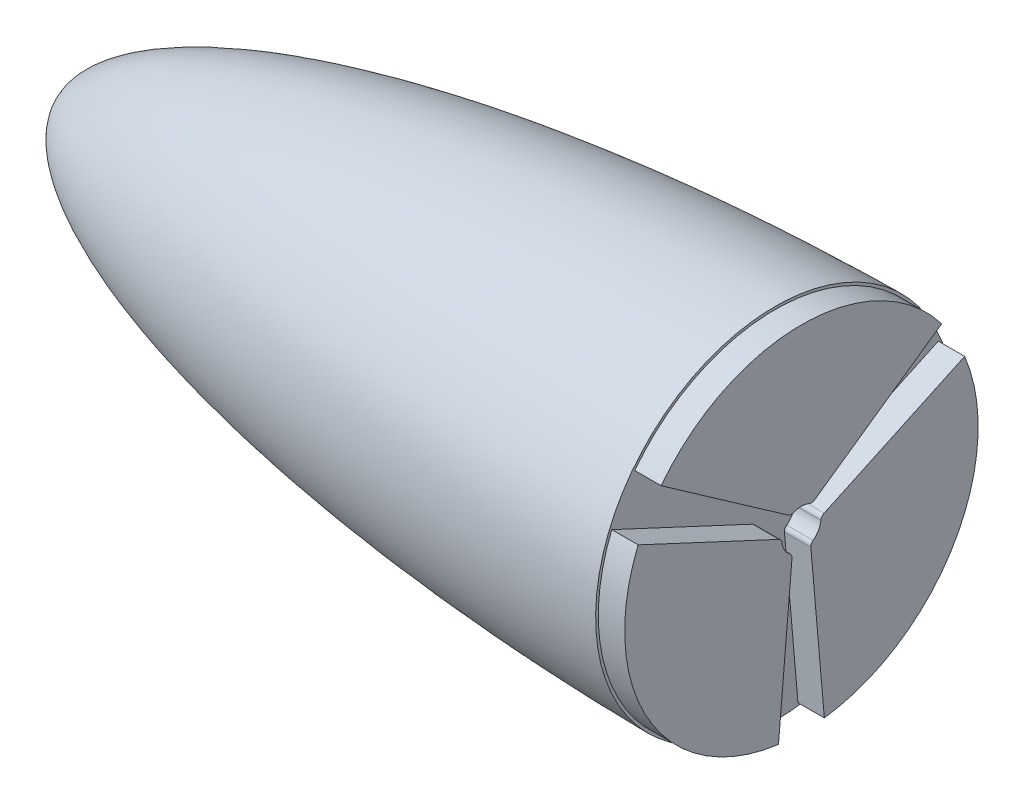
ISO-10303-21;
HEADER;
FILE_DESCRIPTION(('STEP AP214'),'2;1');
FILE_NAME('part.step','',(''),(''),'','','');
FILE_SCHEMA(('AUTOMOTIVE_DESIGN { 1 0 10303 214 1 1 1 1 }'));
ENDSEC;
DATA;
#1=APPLICATION_CONTEXT('core data for automotive mechanical design processes');
#2=APPLICATION_PROTOCOL_DEFINITION('international standard','automotive_design',2000,#1);
#3=PRODUCT_CONTEXT('',#1,'mechanical');
#4=PRODUCT('Part','Part','',(#3));
#5=PRODUCT_RELATED_PRODUCT_CATEGORY('part','',(#4));
#6=PRODUCT_DEFINITION_FORMATION('','',#4);
#7=PRODUCT_DEFINITION_CONTEXT('part definition',#1,'design');
#8=PRODUCT_DEFINITION('design','',#6,#7);
#9=PRODUCT_DEFINITION_SHAPE('','',#8);
#10=(LENGTH_UNIT() NAMED_UNIT(*) SI_UNIT(.MILLI.,.METRE.));
#11=(NAMED_UNIT(*) PLANE_ANGLE_UNIT() SI_UNIT($,.RADIAN.));
#12=(NAMED_UNIT(*) SI_UNIT($,.STERADIAN.) SOLID_ANGLE_UNIT());
#13=UNCERTAINTY_MEASURE_WITH_UNIT(LENGTH_MEASURE(1.E-05),#10,'distance_accuracy_value','');
#14=(GEOMETRIC_REPRESENTATION_CONTEXT(3) GLOBAL_UNCERTAINTY_ASSIGNED_CONTEXT((#13)) GLOBAL_UNIT_ASSIGNED_CONTEXT((#10,
#11,#12)) REPRESENTATION_CONTEXT('',''));
#15=CARTESIAN_POINT('',(0.,0.,0.));
#16=DIRECTION('',(0.,0.,1.));
#17=DIRECTION('',(1.,0.,0.));
#18=AXIS2_PLACEMENT_3D('',#15,#16,#17);
#19=CARTESIAN_POINT('',(-4.69999999999999,31.9790350616926,0.));
#20=DIRECTION('',(1.,0.,0.));
#21=DIRECTION('',(0.,1.,0.));
#22=AXIS2_PLACEMENT_3D('',#19,#20,#21);
#23=PLANE('',#22);
#24=DIRECTION('',(0.,-0.573576436351045,-0.819152044288993));
#25=VECTOR('',#24,1.);
#26=CARTESIAN_POINT('',(-4.69999999999998,19.1571618153973,25.0050625109933));
#27=LINE('',#26,#25);
#28=CARTESIAN_POINT('',(-4.69999999999998,19.1571618153973,25.0050625109933));
#29=VERTEX_POINT('',#28);
#30=CARTESIAN_POINT('',(-4.69999999999998,3.30718331001068,2.36894730161999));
#31=VERTEX_POINT('',#30);
#32=EDGE_CURVE('E623',#29,#31,#27,.T.);
#33=ORIENTED_EDGE('',*,*,#32,.F.);
#34=CARTESIAN_POINT('',(-4.69999999999998,0.,0.));
#35=DIRECTION('',(1.,0.,0.));
#36=DIRECTION('',(0.,1.,0.));
#37=AXIS2_PLACEMENT_3D('',#34,#35,#36);
#38=CIRCLE('',#37,31.5);
#39=CARTESIAN_POINT('',(-4.69999999999998,19.1571618153973,-25.0050625109933));
#40=VERTEX_POINT('',#39);
#41=EDGE_CURVE('E192',#29,#40,#38,.F.);
#42=ORIENTED_EDGE('',*,*,#41,.T.);
#43=DIRECTION('',(0.,0.573576436351044,-0.819152044288993));
#44=VECTOR('',#43,1.);
#45=CARTESIAN_POINT('',(-4.69999999999998,3.30718331001069,-2.36894730161999));
#46=LINE('',#45,#44);
#47=CARTESIAN_POINT('',(-4.69999999999998,3.30718331001068,-2.36894730161999));
#48=VERTEX_POINT('',#47);
#49=EDGE_CURVE('E171',#48,#40,#46,.T.);
#50=ORIENTED_EDGE('',*,*,#49,.F.);
#51=CARTESIAN_POINT('',(-4.69999999999998,4.12633535429968,-1.79537086526895));
#52=DIRECTION('',(1.,0.,0.));
#53=DIRECTION('',(0.,1.,0.));
#54=AXIS2_PLACEMENT_3D('',#51,#52,#53);
#55=CIRCLE('',#54,1.);
#56=CARTESIAN_POINT('',(-4.69999999999998,3.20937194223308,-1.39639956187585));
#57=VERTEX_POINT('',#56);
#58=EDGE_CURVE('E181',#57,#48,#55,.T.);
#59=ORIENTED_EDGE('',*,*,#58,.F.);
#60=CARTESIAN_POINT('',(-4.69999999999998,0.,0.));
#61=DIRECTION('',(1.,0.,0.));
#62=DIRECTION('',(0.,1.,0.));
#63=AXIS2_PLACEMENT_3D('',#60,#61,#62);
#64=CIRCLE('',#63,3.5);
#65=CARTESIAN_POINT('',(-4.69999999999998,3.20937194223308,1.39639956187585));
#66=VERTEX_POINT('',#65);
#67=EDGE_CURVE('E187',#66,#57,#64,.F.);
#68=ORIENTED_EDGE('',*,*,#67,.F.);
#69=CARTESIAN_POINT('',(-4.69999999999998,4.12633535429968,1.79537086526895));
#70=DIRECTION('',(1.,0.,0.));
#71=DIRECTION('',(0.,1.,0.));
#72=AXIS2_PLACEMENT_3D('',#69,#70,#71);
#73=CIRCLE('',#72,1.);
#74=EDGE_CURVE('E626',#31,#66,#73,.T.);
#75=ORIENTED_EDGE('',*,*,#74,.F.);
#76=EDGE_LOOP('',(#33,#42,#50,#59,#68,#75));
#77=FACE_BOUND('',#76,.T.);
#78=DIRECTION('',(0.,-0.422618261740702,0.906307787036649));
#79=VECTOR('',#78,1.);
#80=CARTESIAN_POINT('',(-4.69999999999998,12.0764384500395,-29.0931200520399));
#81=LINE('',#80,#79);
#82=CARTESIAN_POINT('',(-4.69999999999998,12.0764384500395,-29.0931200520399));
#83=VERTEX_POINT('',#82);
#84=CARTESIAN_POINT('',(-4.69999999999998,0.397976888424168,-4.04857841225115));
#85=VERTEX_POINT('',#84);
#86=EDGE_CURVE('E193',#83,#85,#81,.T.);
#87=ORIENTED_EDGE('',*,*,#86,.F.);
#88=CARTESIAN_POINT('',(-4.69999999999998,0.,0.));
#89=DIRECTION('',(1.,0.,0.));
#90=DIRECTION('',(0.,1.,0.));
#91=AXIS2_PLACEMENT_3D('',#88,#89,#90);
#92=CIRCLE('',#91,31.5);
#93=CARTESIAN_POINT('',(-4.69999999999998,-31.2336002654368,-4.08805754104661));
#94=VERTEX_POINT('',#93);
#95=EDGE_CURVE('E202',#83,#94,#92,.F.);
#96=ORIENTED_EDGE('',*,*,#95,.T.);
#97=DIRECTION('',(0.,-0.996194698091746,-0.0871557427476563));
#98=VECTOR('',#97,1.);
#99=CARTESIAN_POINT('',(-4.69999999999998,-3.70516019843484,-1.67963111063116));
#100=LINE('',#99,#98);
#101=CARTESIAN_POINT('',(-4.69999999999998,-3.70516019843485,-1.67963111063116));
#102=VERTEX_POINT('',#101);
#103=EDGE_CURVE('E589',#102,#94,#100,.T.);
#104=ORIENTED_EDGE('',*,*,#103,.F.);
#105=CARTESIAN_POINT('',(-4.69999999999998,-3.61800445568719,-2.67582580872291));
#106=DIRECTION('',(1.,0.,0.));
#107=DIRECTION('',(0.,1.,0.));
#108=AXIS2_PLACEMENT_3D('',#105,#106,#107);
#109=CIRCLE('',#108,1.);
#110=CARTESIAN_POINT('',(-4.69999999999998,-2.81400346553449,-2.08119785122893));
#111=VERTEX_POINT('',#110);
#112=EDGE_CURVE('E601',#111,#102,#109,.T.);
#113=ORIENTED_EDGE('',*,*,#112,.F.);
#114=CARTESIAN_POINT('',(-4.69999999999998,0.,0.));
#115=DIRECTION('',(1.,0.,0.));
#116=DIRECTION('',(0.,1.,0.));
#117=AXIS2_PLACEMENT_3D('',#114,#115,#116);
#118=CIRCLE('',#117,3.5);
#119=CARTESIAN_POINT('',(-4.69999999999998,-0.395368476698597,-3.47759741310478));
#120=VERTEX_POINT('',#119);
#121=EDGE_CURVE('E604',#120,#111,#118,.F.);
#122=ORIENTED_EDGE('',*,*,#121,.F.);
#123=CARTESIAN_POINT('',(-4.69999999999998,-0.508330898612481,-4.47119667399186));
#124=DIRECTION('',(1.,0.,0.));
#125=DIRECTION('',(0.,1.,0.));
#126=AXIS2_PLACEMENT_3D('',#123,#124,#125);
#127=CIRCLE('',#126,1.);
#128=EDGE_CURVE('E198',#85,#120,#127,.T.);
#129=ORIENTED_EDGE('',*,*,#128,.F.);
#130=EDGE_LOOP('',(#87,#96,#104,#113,#122,#129));
#131=FACE_BOUND('',#130,.T.);
#132=DIRECTION('',(0.,0.996194698091746,-0.0871557427476555));
#133=VECTOR('',#132,1.);
#134=CARTESIAN_POINT('',(-4.69999999999997,-31.2336002654368,4.08805754104658));
#135=LINE('',#134,#133);
#136=CARTESIAN_POINT('',(-4.69999999999997,-31.2336002654368,4.08805754104658));
#137=VERTEX_POINT('',#136);
#138=CARTESIAN_POINT('',(-4.69999999999998,-3.70516019843485,1.67963111063116));
#139=VERTEX_POINT('',#138);
#140=EDGE_CURVE('E585',#137,#139,#135,.T.);
#141=ORIENTED_EDGE('',*,*,#140,.F.);
#142=CARTESIAN_POINT('',(-4.69999999999998,0.,0.));
#143=DIRECTION('',(1.,0.,0.));
#144=DIRECTION('',(0.,1.,0.));
#145=AXIS2_PLACEMENT_3D('',#142,#143,#144);
#146=CIRCLE('',#145,31.5);
#147=CARTESIAN_POINT('',(-4.69999999999998,12.0764384500395,29.0931200520399));
#148=VERTEX_POINT('',#147);
#149=EDGE_CURVE('E210',#137,#148,#146,.F.);
#150=ORIENTED_EDGE('',*,*,#149,.T.);
#151=DIRECTION('',(0.,0.422618261740701,0.906307787036649));
#152=VECTOR('',#151,1.);
#153=CARTESIAN_POINT('',(-4.69999999999998,0.397976888424167,4.04857841225116));
#154=LINE('',#153,#152);
#155=CARTESIAN_POINT('',(-4.69999999999998,0.397976888424166,4.04857841225115));
#156=VERTEX_POINT('',#155);
#157=EDGE_CURVE('E621',#156,#148,#154,.T.);
#158=ORIENTED_EDGE('',*,*,#157,.F.);
#159=CARTESIAN_POINT('',(-4.69999999999998,-0.508330898612485,4.47119667399186));
#160=DIRECTION('',(1.,0.,0.));
#161=DIRECTION('',(0.,1.,0.));
#162=AXIS2_PLACEMENT_3D('',#159,#160,#161);
#163=CIRCLE('',#162,1.);
#164=CARTESIAN_POINT('',(-4.69999999999998,-0.395368476698599,3.47759741310478));
#165=VERTEX_POINT('',#164);
#166=EDGE_CURVE('E575',#165,#156,#163,.T.);
#167=ORIENTED_EDGE('',*,*,#166,.F.);
#168=CARTESIAN_POINT('',(-4.69999999999998,0.,0.));
#169=DIRECTION('',(1.,0.,0.));
#170=DIRECTION('',(0.,1.,0.));
#171=AXIS2_PLACEMENT_3D('',#168,#169,#170);
#172=CIRCLE('',#171,3.5);
#173=CARTESIAN_POINT('',(-4.69999999999998,-2.81400346553449,2.08119785122893));
#174=VERTEX_POINT('',#173);
#175=EDGE_CURVE('E594',#174,#165,#172,.F.);
#176=ORIENTED_EDGE('',*,*,#175,.F.);
#177=CARTESIAN_POINT('',(-4.69999999999998,-3.6180044556872,2.67582580872291));
#178=DIRECTION('',(1.,0.,0.));
#179=DIRECTION('',(0.,1.,0.));
#180=AXIS2_PLACEMENT_3D('',#177,#178,#179);
#181=CIRCLE('',#180,1.);
#182=EDGE_CURVE('E590',#139,#174,#181,.T.);
#183=ORIENTED_EDGE('',*,*,#182,.F.);
#184=EDGE_LOOP('',(#141,#150,#158,#167,#176,#183));
#185=FACE_BOUND('',#184,.T.);
#186=CARTESIAN_POINT('',(-4.69999999999997,0.,0.));
#187=DIRECTION('',(-1.,0.,0.));
#188=DIRECTION('',(0.,-1.,0.));
#189=AXIS2_PLACEMENT_3D('',#186,#187,#188);
#190=CIRCLE('',#189,31.9790350616926);
#191=CARTESIAN_POINT('',(-4.69999999999996,-31.9790350616926,0.));
#192=VERTEX_POINT('',#191);
#193=EDGE_CURVE('E237',#192,#192,#190,.T.);
#194=ORIENTED_EDGE('',*,*,#193,.F.);
#195=EDGE_LOOP('',(#194));
#196=FACE_BOUND('',#195,.T.);
#197=ADVANCED_FACE('F38',(#77,#131,#185,#196),#23,.T.);
#198=CARTESIAN_POINT('',(-131.041604602779,0.,0.));
#199=DIRECTION('',(1.,0.,0.));
#200=DIRECTION('',(0.,1.,0.));
#201=AXIS2_PLACEMENT_3D('',#198,#199,#200);
#202=CONICAL_SURFACE('',#201,0.,1.46069474876137);
#203=CARTESIAN_POINT('',(-130.931055959932,0.,0.));
#204=DIRECTION('',(-1.,0.,0.));
#205=DIRECTION('',(0.,-1.,0.));
#206=AXIS2_PLACEMENT_3D('',#203,#204,#205);
#207=CIRCLE('',#206,1.00000000000001);
#208=CARTESIAN_POINT('',(-130.931055959932,-1.00000000000002,0.));
#209=VERTEX_POINT('',#208);
#210=EDGE_CURVE('E563',#209,#209,#207,.T.);
#211=ORIENTED_EDGE('',*,*,#210,.T.);
#212=EDGE_LOOP('',(#211));
#213=FACE_BOUND('',#212,.T.);
#214=CARTESIAN_POINT('',(-131.041604602779,0.,0.));
#215=VERTEX_POINT('',#214);
#216=VERTEX_LOOP('',#215);
#217=FACE_BOUND('',#216,.T.);
#218=ADVANCED_FACE('F264',(#213,#217),#202,.T.);
#219=CARTESIAN_POINT('',(-130.931055959932,1.00000000000001,0.));
#220=CARTESIAN_POINT('',(-130.865742506372,1.47381555135,0.));
#221=CARTESIAN_POINT('',(-130.651172956967,2.38881913210286,0.));
#222=CARTESIAN_POINT('',(-129.84731326767,4.28583718277814,0.));
#223=CARTESIAN_POINT('',(-128.119817366122,6.69901842769236,0.));
#224=CARTESIAN_POINT('',(-124.84839957675,9.62348496806843,0.));
#225=CARTESIAN_POINT('',(-120.403954252426,12.4998788464775,0.));
#226=CARTESIAN_POINT('',(-114.83293554596,15.2811529394665,0.));
#227=CARTESIAN_POINT('',(-105.980733044591,18.8122966931907,0.));
#228=CARTESIAN_POINT('',(-92.4063202601802,22.8163482242186,0.));
#229=CARTESIAN_POINT('',(-72.7180652242926,26.767950382988,0.));
#230=CARTESIAN_POINT('',(-50.363967687195,29.7157861327046,0.));
#231=CARTESIAN_POINT('',(-30.1948269393781,31.2434611253041,0.));
#232=CARTESIAN_POINT('',(-13.5883296727057,31.874860447828,0.));
#233=CARTESIAN_POINT('',(-5.18845195188157,31.991136157211,0.));
#234=CARTESIAN_POINT('',(-1.00000008461594,31.9990851485101,0.));
#235=B_SPLINE_CURVE_WITH_KNOTS('',3,(#219,#220,#221,#222,#223,#224,#225,#226,#227,#228,#229,
#230,#231,#232,#233,#234),.UNSPECIFIED.,.F.,.F.,(4,1,1,1,1,1,1,1,1,1,1,1,1,4),
(-1.56320612069865,-1.51543242519789,-1.46765872969714,-1.37211133869563,-1.27656394769413,
-1.18101655669262,-1.08546916569112,-0.98992177468961,-0.798826992686597,-0.607732210683585,
-0.416637428680573,-0.22554264667756,-0.129995255676054,-0.0344478646745481),.UNSPECIFIED.);
#236=CARTESIAN_POINT('',(-92.0000000000302,0.,0.));
#237=DIRECTION('',(-1.,0.,0.));
#238=AXIS1_PLACEMENT('',#236,#237);
#239=SURFACE_OF_REVOLUTION('',#235,#238);
#240=ORIENTED_EDGE('',*,*,#193,.T.);
#241=EDGE_LOOP('',(#240));
#242=FACE_BOUND('',#241,.T.);
#243=ORIENTED_EDGE('',*,*,#210,.F.);
#244=EDGE_LOOP('',(#243));
#245=FACE_BOUND('',#244,.T.);
#246=ADVANCED_FACE('F259',(#242,#245),#239,.F.);
#247=CARTESIAN_POINT('',(-62.28165003066,0.,0.));
#248=DIRECTION('',(1.,0.,0.));
#249=DIRECTION('',(0.,1.,0.));
#250=AXIS2_PLACEMENT_3D('',#247,#248,#249);
#251=CYLINDRICAL_SURFACE('',#250,3.5);
#252=CARTESIAN_POINT('',(0.,0.,0.));
#253=DIRECTION('',(-1.,0.,0.));
#254=DIRECTION('',(0.,1.,0.));
#255=AXIS2_PLACEMENT_3D('',#252,#253,#254);
#256=CIRCLE('',#255,3.5);
#257=CARTESIAN_POINT('',(0.,3.20937194223308,1.39639956187585));
#258=VERTEX_POINT('',#257);
#259=CARTESIAN_POINT('',(0.,3.20937194223308,-1.39639956187585));
#260=VERTEX_POINT('',#259);
#261=EDGE_CURVE('E61',#258,#260,#256,.T.);
#262=ORIENTED_EDGE('',*,*,#261,.F.);
#263=DIRECTION('',(1.,0.,0.));
#264=VECTOR('',#263,1.);
#265=CARTESIAN_POINT('',(-62.28165003066,3.20937194223307,1.39639956187585));
#266=LINE('',#265,#264);
#267=EDGE_CURVE('E177',#66,#258,#266,.T.);
#268=ORIENTED_EDGE('',*,*,#267,.F.);
#269=ORIENTED_EDGE('',*,*,#67,.T.);
#270=DIRECTION('',(1.,0.,0.));
#271=VECTOR('',#270,1.);
#272=CARTESIAN_POINT('',(-62.28165003066,3.20937194223308,-1.39639956187585));
#273=LINE('',#272,#271);
#274=EDGE_CURVE('E183',#260,#57,#273,.F.);
#275=ORIENTED_EDGE('',*,*,#274,.F.);
#276=EDGE_LOOP('',(#262,#268,#269,#275));
#277=FACE_BOUND('',#276,.T.);
#278=ADVANCED_FACE('F263',(#277),#251,.F.);
#279=CARTESIAN_POINT('',(-62.28165003066,2.95820931443388,1.87056078543216));
#280=DIRECTION('',(0.,-0.819152044288993,0.573576436351044));
#281=DIRECTION('',(0.,-0.573576436351044,-0.819152044288993));
#282=AXIS2_PLACEMENT_3D('',#279,#280,#281);
#283=PLANE('',#282);
#284=DIRECTION('',(0.,-0.573576436351044,-0.819152044288993));
#285=VECTOR('',#284,1.);
#286=CARTESIAN_POINT('',(0.,2.95820931443389,1.87056078543216));
#287=LINE('',#286,#285);
#288=CARTESIAN_POINT('',(0.,19.1571618153973,25.0050625109933));
#289=VERTEX_POINT('',#288);
#290=CARTESIAN_POINT('',(0.,3.30718331001068,2.36894730161999));
#291=VERTEX_POINT('',#290);
#292=EDGE_CURVE('E244',#289,#291,#287,.T.);
#293=ORIENTED_EDGE('',*,*,#292,.F.);
#294=DIRECTION('',(1.,0.,0.));
#295=VECTOR('',#294,1.);
#296=CARTESIAN_POINT('',(-62.28165003066,19.1571618153973,25.0050625109933));
#297=LINE('',#296,#295);
#298=EDGE_CURVE('E238',#29,#289,#297,.T.);
#299=ORIENTED_EDGE('',*,*,#298,.F.);
#300=ORIENTED_EDGE('',*,*,#32,.T.);
#301=DIRECTION('',(-1.,0.,0.));
#302=VECTOR('',#301,1.);
#303=CARTESIAN_POINT('',(-3.7,3.30718331001068,2.36894730161999));
#304=LINE('',#303,#302);
#305=EDGE_CURVE('E547',#291,#31,#304,.T.);
#306=ORIENTED_EDGE('',*,*,#305,.F.);
#307=EDGE_LOOP('',(#293,#299,#300,#306));
#308=FACE_BOUND('',#307,.T.);
#309=ADVANCED_FACE('F316',(#308),#283,.T.);
#310=CARTESIAN_POINT('',(-62.28165003066,0.,0.));
#311=DIRECTION('',(1.,0.,0.));
#312=DIRECTION('',(0.,1.,0.));
#313=AXIS2_PLACEMENT_3D('',#310,#311,#312);
#314=CYLINDRICAL_SURFACE('',#313,31.5);
#315=ORIENTED_EDGE('',*,*,#41,.F.);
#316=ORIENTED_EDGE('',*,*,#298,.T.);
#317=CARTESIAN_POINT('',(0.,0.,0.));
#318=DIRECTION('',(1.,0.,0.));
#319=DIRECTION('',(0.,1.,0.));
#320=AXIS2_PLACEMENT_3D('',#317,#318,#319);
#321=CIRCLE('',#320,31.5);
#322=CARTESIAN_POINT('',(0.,19.1571618153973,-25.0050625109933));
#323=VERTEX_POINT('',#322);
#324=EDGE_CURVE('E241',#323,#289,#321,.T.);
#325=ORIENTED_EDGE('',*,*,#324,.F.);
#326=DIRECTION('',(1.,0.,0.));
#327=VECTOR('',#326,1.);
#328=CARTESIAN_POINT('',(-62.28165003066,19.1571618153973,-25.0050625109933));
#329=LINE('',#328,#327);
#330=EDGE_CURVE('E247',#40,#323,#329,.T.);
#331=ORIENTED_EDGE('',*,*,#330,.F.);
#332=EDGE_LOOP('',(#315,#316,#325,#331));
#333=FACE_BOUND('',#332,.T.);
#334=ADVANCED_FACE('F322',(#333),#314,.T.);
#335=CARTESIAN_POINT('',(-62.28165003066,2.95820931443388,-1.87056078543216));
#336=DIRECTION('',(0.,-0.819152044288993,-0.573576436351044));
#337=DIRECTION('',(0.,0.573576436351044,-0.819152044288993));
#338=AXIS2_PLACEMENT_3D('',#335,#336,#337);
#339=PLANE('',#338);
#340=DIRECTION('',(-1.,0.,0.));
#341=VECTOR('',#340,1.);
#342=CARTESIAN_POINT('',(0.,3.30718331001068,-2.36894730161999));
#343=LINE('',#342,#341);
#344=CARTESIAN_POINT('',(0.,3.30718331001068,-2.36894730161999));
#345=VERTEX_POINT('',#344);
#346=EDGE_CURVE('E167',#48,#345,#343,.F.);
#347=ORIENTED_EDGE('',*,*,#346,.F.);
#348=ORIENTED_EDGE('',*,*,#49,.T.);
#349=ORIENTED_EDGE('',*,*,#330,.T.);
#350=DIRECTION('',(0.,0.573576436351044,-0.819152044288993));
#351=VECTOR('',#350,1.);
#352=CARTESIAN_POINT('',(0.,2.95820931443389,-1.87056078543216));
#353=LINE('',#352,#351);
#354=EDGE_CURVE('E174',#345,#323,#353,.T.);
#355=ORIENTED_EDGE('',*,*,#354,.F.);
#356=EDGE_LOOP('',(#347,#348,#349,#355));
#357=FACE_BOUND('',#356,.T.);
#358=ADVANCED_FACE('F169',(#357),#339,.T.);
#359=CARTESIAN_POINT('',(-62.28165003066,0.,0.));
#360=DIRECTION('',(1.,0.,0.));
#361=DIRECTION('',(0.,1.,0.));
#362=AXIS2_PLACEMENT_3D('',#359,#360,#361);
#363=CYLINDRICAL_SURFACE('',#362,3.5);
#364=DIRECTION('',(1.,0.,0.));
#365=VECTOR('',#364,1.);
#366=CARTESIAN_POINT('',(-62.28165003066,-0.395368476698604,-3.47759741310478));
#367=LINE('',#366,#365);
#368=CARTESIAN_POINT('',(0.,-0.395368476698597,-3.47759741310478));
#369=VERTEX_POINT('',#368);
#370=EDGE_CURVE('E552',#120,#369,#367,.T.);
#371=ORIENTED_EDGE('',*,*,#370,.F.);
#372=ORIENTED_EDGE('',*,*,#121,.T.);
#373=DIRECTION('',(1.,0.,0.));
#374=VECTOR('',#373,1.);
#375=CARTESIAN_POINT('',(-62.28165003066,-2.81400346553449,-2.08119785122893));
#376=LINE('',#375,#374);
#377=CARTESIAN_POINT('',(0.,-2.81400346553448,-2.08119785122893));
#378=VERTEX_POINT('',#377);
#379=EDGE_CURVE('E554',#378,#111,#376,.F.);
#380=ORIENTED_EDGE('',*,*,#379,.F.);
#381=CARTESIAN_POINT('',(0.,0.,0.));
#382=DIRECTION('',(-1.,0.,0.));
#383=DIRECTION('',(0.,1.,0.));
#384=AXIS2_PLACEMENT_3D('',#381,#382,#383);
#385=CIRCLE('',#384,3.5);
#386=EDGE_CURVE('E206',#369,#378,#385,.T.);
#387=ORIENTED_EDGE('',*,*,#386,.F.);
#388=EDGE_LOOP('',(#371,#372,#380,#387));
#389=FACE_BOUND('',#388,.T.);
#390=ADVANCED_FACE('F337',(#389),#363,.F.);
#391=CARTESIAN_POINT('',(-62.28165003066,0.140848502290271,-3.49716480872758));
#392=DIRECTION('',(0.,0.906307787036649,0.422618261740702));
#393=DIRECTION('',(0.,-0.422618261740702,0.906307787036649));
#394=AXIS2_PLACEMENT_3D('',#391,#392,#393);
#395=PLANE('',#394);
#396=DIRECTION('',(0.,-0.422618261740702,0.906307787036649));
#397=VECTOR('',#396,1.);
#398=CARTESIAN_POINT('',(0.,0.140848502290279,-3.49716480872758));
#399=LINE('',#398,#397);
#400=CARTESIAN_POINT('',(0.,12.0764384500395,-29.0931200520399));
#401=VERTEX_POINT('',#400);
#402=CARTESIAN_POINT('',(0.,0.397976888424169,-4.04857841225115));
#403=VERTEX_POINT('',#402);
#404=EDGE_CURVE('E216',#401,#403,#399,.T.);
#405=ORIENTED_EDGE('',*,*,#404,.F.);
#406=DIRECTION('',(1.,0.,0.));
#407=VECTOR('',#406,1.);
#408=CARTESIAN_POINT('',(-62.28165003066,12.0764384500395,-29.0931200520399));
#409=LINE('',#408,#407);
#410=EDGE_CURVE('E205',#83,#401,#409,.T.);
#411=ORIENTED_EDGE('',*,*,#410,.F.);
#412=ORIENTED_EDGE('',*,*,#86,.T.);
#413=DIRECTION('',(-1.,0.,0.));
#414=VECTOR('',#413,1.);
#415=CARTESIAN_POINT('',(-3.7,0.397976888424168,-4.04857841225115));
#416=LINE('',#415,#414);
#417=EDGE_CURVE('E178',#403,#85,#416,.T.);
#418=ORIENTED_EDGE('',*,*,#417,.F.);
#419=EDGE_LOOP('',(#405,#411,#412,#418));
#420=FACE_BOUND('',#419,.T.);
#421=ADVANCED_FACE('F344',(#420),#395,.T.);
#422=CARTESIAN_POINT('',(-62.28165003066,0.,0.));
#423=DIRECTION('',(1.,0.,0.));
#424=DIRECTION('',(0.,1.,0.));
#425=AXIS2_PLACEMENT_3D('',#422,#423,#424);
#426=CYLINDRICAL_SURFACE('',#425,31.5);
#427=ORIENTED_EDGE('',*,*,#95,.F.);
#428=ORIENTED_EDGE('',*,*,#410,.T.);
#429=CARTESIAN_POINT('',(0.,0.,0.));
#430=DIRECTION('',(1.,0.,0.));
#431=DIRECTION('',(0.,1.,0.));
#432=AXIS2_PLACEMENT_3D('',#429,#430,#431);
#433=CIRCLE('',#432,31.5);
#434=CARTESIAN_POINT('',(0.,-31.2336002654368,-4.08805754104661));
#435=VERTEX_POINT('',#434);
#436=EDGE_CURVE('E213',#435,#401,#433,.T.);
#437=ORIENTED_EDGE('',*,*,#436,.F.);
#438=DIRECTION('',(1.,0.,0.));
#439=VECTOR('',#438,1.);
#440=CARTESIAN_POINT('',(-62.2816500306599,-31.2336002654368,-4.08805754104661));
#441=LINE('',#440,#439);
#442=EDGE_CURVE('E219',#94,#435,#441,.T.);
#443=ORIENTED_EDGE('',*,*,#442,.F.);
#444=EDGE_LOOP('',(#427,#428,#437,#443));
#445=FACE_BOUND('',#444,.T.);
#446=ADVANCED_FACE('F352',(#445),#426,.T.);
#447=CARTESIAN_POINT('',(-62.28165003066,-3.09905781672418,-1.62660402329542));
#448=DIRECTION('',(0.,-0.0871557427476564,0.996194698091746));
#449=DIRECTION('',(0.,-0.996194698091746,-0.0871557427476564));
#450=AXIS2_PLACEMENT_3D('',#447,#448,#449);
#451=PLANE('',#450);
#452=DIRECTION('',(-1.,0.,0.));
#453=VECTOR('',#452,1.);
#454=CARTESIAN_POINT('',(0.,-3.70516019843485,-1.67963111063116));
#455=LINE('',#454,#453);
#456=CARTESIAN_POINT('',(0.,-3.70516019843485,-1.67963111063116));
#457=VERTEX_POINT('',#456);
#458=EDGE_CURVE('E544',#102,#457,#455,.F.);
#459=ORIENTED_EDGE('',*,*,#458,.F.);
#460=ORIENTED_EDGE('',*,*,#103,.T.);
#461=ORIENTED_EDGE('',*,*,#442,.T.);
#462=DIRECTION('',(0.,-0.996194698091746,-0.0871557427476564));
#463=VECTOR('',#462,1.);
#464=CARTESIAN_POINT('',(0.,-3.09905781672417,-1.62660402329542));
#465=LINE('',#464,#463);
#466=EDGE_CURVE('E209',#457,#435,#465,.T.);
#467=ORIENTED_EDGE('',*,*,#466,.F.);
#468=EDGE_LOOP('',(#459,#460,#461,#467));
#469=FACE_BOUND('',#468,.T.);
#470=ADVANCED_FACE('F360',(#469),#451,.T.);
#471=CARTESIAN_POINT('',(-62.28165003066,0.,0.));
#472=DIRECTION('',(1.,0.,0.));
#473=DIRECTION('',(0.,1.,0.));
#474=AXIS2_PLACEMENT_3D('',#471,#472,#473);
#475=CYLINDRICAL_SURFACE('',#474,3.5);
#476=CARTESIAN_POINT('',(0.,0.,0.));
#477=DIRECTION('',(-1.,0.,0.));
#478=DIRECTION('',(0.,1.,0.));
#479=AXIS2_PLACEMENT_3D('',#476,#477,#478);
#480=CIRCLE('',#479,3.5);
#481=CARTESIAN_POINT('',(0.,-2.81400346553448,2.08119785122893));
#482=VERTEX_POINT('',#481);
#483=CARTESIAN_POINT('',(0.,-0.395368476698599,3.47759741310478));
#484=VERTEX_POINT('',#483);
#485=EDGE_CURVE('E53',#482,#484,#480,.T.);
#486=ORIENTED_EDGE('',*,*,#485,.F.);
#487=DIRECTION('',(1.,0.,0.));
#488=VECTOR('',#487,1.);
#489=CARTESIAN_POINT('',(-62.28165003066,-2.81400346553449,2.08119785122893));
#490=LINE('',#489,#488);
#491=EDGE_CURVE('E560',#174,#482,#490,.T.);
#492=ORIENTED_EDGE('',*,*,#491,.F.);
#493=ORIENTED_EDGE('',*,*,#175,.T.);
#494=DIRECTION('',(1.,0.,0.));
#495=VECTOR('',#494,1.);
#496=CARTESIAN_POINT('',(-62.28165003066,-0.395368476698607,3.47759741310478));
#497=LINE('',#496,#495);
#498=EDGE_CURVE('E558',#484,#165,#497,.F.);
#499=ORIENTED_EDGE('',*,*,#498,.F.);
#500=EDGE_LOOP('',(#486,#492,#493,#499));
#501=FACE_BOUND('',#500,.T.);
#502=ADVANCED_FACE('F368',(#501),#475,.F.);
#503=CARTESIAN_POINT('',(-62.28165003066,-3.09905781672418,1.62660402329542));
#504=DIRECTION('',(0.,-0.0871557427476557,-0.996194698091746));
#505=DIRECTION('',(0.,0.996194698091746,-0.0871557427476557));
#506=AXIS2_PLACEMENT_3D('',#503,#504,#505);
#507=PLANE('',#506);
#508=DIRECTION('',(0.,0.996194698091746,-0.0871557427476556));
#509=VECTOR('',#508,1.);
#510=CARTESIAN_POINT('',(0.,-3.09905781672417,1.62660402329542));
#511=LINE('',#510,#509);
#512=CARTESIAN_POINT('',(0.,-31.2336002654368,4.08805754104658));
#513=VERTEX_POINT('',#512);
#514=CARTESIAN_POINT('',(0.,-3.70516019843485,1.67963111063116));
#515=VERTEX_POINT('',#514);
#516=EDGE_CURVE('E230',#513,#515,#511,.T.);
#517=ORIENTED_EDGE('',*,*,#516,.F.);
#518=DIRECTION('',(1.,0.,0.));
#519=VECTOR('',#518,1.);
#520=CARTESIAN_POINT('',(-62.2816500306599,-31.2336002654368,4.08805754104658));
#521=LINE('',#520,#519);
#522=EDGE_CURVE('E223',#137,#513,#521,.T.);
#523=ORIENTED_EDGE('',*,*,#522,.F.);
#524=ORIENTED_EDGE('',*,*,#140,.T.);
#525=DIRECTION('',(-1.,0.,0.));
#526=VECTOR('',#525,1.);
#527=CARTESIAN_POINT('',(-3.7,-3.70516019843485,1.67963111063116));
#528=LINE('',#527,#526);
#529=EDGE_CURVE('E556',#515,#139,#528,.T.);
#530=ORIENTED_EDGE('',*,*,#529,.F.);
#531=EDGE_LOOP('',(#517,#523,#524,#530));
#532=FACE_BOUND('',#531,.T.);
#533=ADVANCED_FACE('F376',(#532),#507,.T.);
#534=CARTESIAN_POINT('',(-62.28165003066,0.,0.));
#535=DIRECTION('',(1.,0.,0.));
#536=DIRECTION('',(0.,1.,0.));
#537=AXIS2_PLACEMENT_3D('',#534,#535,#536);
#538=CYLINDRICAL_SURFACE('',#537,31.5);
#539=ORIENTED_EDGE('',*,*,#149,.F.);
#540=ORIENTED_EDGE('',*,*,#522,.T.);
#541=CARTESIAN_POINT('',(0.,0.,0.));
#542=DIRECTION('',(1.,0.,0.));
#543=DIRECTION('',(0.,1.,0.));
#544=AXIS2_PLACEMENT_3D('',#541,#542,#543);
#545=CIRCLE('',#544,31.5);
#546=CARTESIAN_POINT('',(0.,12.0764384500395,29.0931200520399));
#547=VERTEX_POINT('',#546);
#548=EDGE_CURVE('E227',#547,#513,#545,.T.);
#549=ORIENTED_EDGE('',*,*,#548,.F.);
#550=DIRECTION('',(1.,0.,0.));
#551=VECTOR('',#550,1.);
#552=CARTESIAN_POINT('',(-62.28165003066,12.0764384500395,29.0931200520399));
#553=LINE('',#552,#551);
#554=EDGE_CURVE('E233',#148,#547,#553,.T.);
#555=ORIENTED_EDGE('',*,*,#554,.F.);
#556=EDGE_LOOP('',(#539,#540,#549,#555));
#557=FACE_BOUND('',#556,.T.);
#558=ADVANCED_FACE('F383',(#557),#538,.T.);
#559=CARTESIAN_POINT('',(-62.28165003066,0.140848502290269,3.49716480872758));
#560=DIRECTION('',(0.,0.906307787036649,-0.422618261740701));
#561=DIRECTION('',(0.,0.422618261740701,0.906307787036649));
#562=AXIS2_PLACEMENT_3D('',#559,#560,#561);
#563=PLANE('',#562);
#564=DIRECTION('',(-1.,0.,0.));
#565=VECTOR('',#564,1.);
#566=CARTESIAN_POINT('',(0.,0.397976888424166,4.04857841225115));
#567=LINE('',#566,#565);
#568=CARTESIAN_POINT('',(0.,0.397976888424166,4.04857841225115));
#569=VERTEX_POINT('',#568);
#570=EDGE_CURVE('E562',#156,#569,#567,.F.);
#571=ORIENTED_EDGE('',*,*,#570,.F.);
#572=ORIENTED_EDGE('',*,*,#157,.T.);
#573=ORIENTED_EDGE('',*,*,#554,.T.);
#574=DIRECTION('',(0.,0.422618261740701,0.906307787036649));
#575=VECTOR('',#574,1.);
#576=CARTESIAN_POINT('',(0.,0.140848502290276,3.49716480872758));
#577=LINE('',#576,#575);
#578=EDGE_CURVE('E195',#569,#547,#577,.T.);
#579=ORIENTED_EDGE('',*,*,#578,.F.);
#580=EDGE_LOOP('',(#571,#572,#573,#579));
#581=FACE_BOUND('',#580,.T.);
#582=ADVANCED_FACE('F274',(#581),#563,.T.);
#583=CARTESIAN_POINT('',(-62.28165003066,-0.508330898612492,4.47119667399186));
#584=DIRECTION('',(1.,0.,0.));
#585=DIRECTION('',(0.,1.,0.));
#586=AXIS2_PLACEMENT_3D('',#583,#584,#585);
#587=CYLINDRICAL_SURFACE('',#586,1.);
#588=ORIENTED_EDGE('',*,*,#498,.T.);
#589=ORIENTED_EDGE('',*,*,#166,.T.);
#590=ORIENTED_EDGE('',*,*,#570,.T.);
#591=CARTESIAN_POINT('',(0.,-0.508330898612485,4.47119667399186));
#592=DIRECTION('',(-1.,0.,0.));
#593=DIRECTION('',(0.,-1.,0.));
#594=AXIS2_PLACEMENT_3D('',#591,#592,#593);
#595=CIRCLE('',#594,1.);
#596=EDGE_CURVE('E542',#569,#484,#595,.T.);
#597=ORIENTED_EDGE('',*,*,#596,.T.);
#598=EDGE_LOOP('',(#588,#589,#590,#597));
#599=FACE_BOUND('',#598,.T.);
#600=ADVANCED_FACE('F270',(#599),#587,.T.);
#601=CARTESIAN_POINT('',(-62.28165003066,-3.6180044556872,2.67582580872291));
#602=DIRECTION('',(1.,0.,0.));
#603=DIRECTION('',(0.,1.,0.));
#604=AXIS2_PLACEMENT_3D('',#601,#602,#603);
#605=CYLINDRICAL_SURFACE('',#604,1.);
#606=ORIENTED_EDGE('',*,*,#529,.T.);
#607=ORIENTED_EDGE('',*,*,#182,.T.);
#608=ORIENTED_EDGE('',*,*,#491,.T.);
#609=CARTESIAN_POINT('',(0.,-3.6180044556872,2.67582580872291));
#610=DIRECTION('',(-1.,0.,0.));
#611=DIRECTION('',(0.,-1.,0.));
#612=AXIS2_PLACEMENT_3D('',#609,#610,#611);
#613=CIRCLE('',#612,1.);
#614=EDGE_CURVE('E538',#482,#515,#613,.T.);
#615=ORIENTED_EDGE('',*,*,#614,.T.);
#616=EDGE_LOOP('',(#606,#607,#608,#615));
#617=FACE_BOUND('',#616,.T.);
#618=ADVANCED_FACE('F273',(#617),#605,.T.);
#619=CARTESIAN_POINT('',(-62.28165003066,4.12633535429967,-1.79537086526895));
#620=DIRECTION('',(1.,0.,0.));
#621=DIRECTION('',(0.,1.,0.));
#622=AXIS2_PLACEMENT_3D('',#619,#620,#621);
#623=CYLINDRICAL_SURFACE('',#622,1.);
#624=CARTESIAN_POINT('',(0.,4.12633535429968,-1.79537086526895));
#625=DIRECTION('',(-1.,0.,0.));
#626=DIRECTION('',(0.,-1.,0.));
#627=AXIS2_PLACEMENT_3D('',#624,#625,#626);
#628=CIRCLE('',#627,1.);
#629=EDGE_CURVE('E534',#345,#260,#628,.T.);
#630=ORIENTED_EDGE('',*,*,#629,.T.);
#631=ORIENTED_EDGE('',*,*,#274,.T.);
#632=ORIENTED_EDGE('',*,*,#58,.T.);
#633=ORIENTED_EDGE('',*,*,#346,.T.);
#634=EDGE_LOOP('',(#630,#631,#632,#633));
#635=FACE_BOUND('',#634,.T.);
#636=ADVANCED_FACE('F182',(#635),#623,.T.);
#637=CARTESIAN_POINT('',(-62.28165003066,4.12633535429967,1.79537086526895));
#638=DIRECTION('',(1.,0.,0.));
#639=DIRECTION('',(0.,1.,0.));
#640=AXIS2_PLACEMENT_3D('',#637,#638,#639);
#641=CYLINDRICAL_SURFACE('',#640,1.);
#642=CARTESIAN_POINT('',(0.,4.12633535429968,1.79537086526895));
#643=DIRECTION('',(-1.,0.,0.));
#644=DIRECTION('',(0.,-1.,0.));
#645=AXIS2_PLACEMENT_3D('',#642,#643,#644);
#646=CIRCLE('',#645,1.);
#647=EDGE_CURVE('E46',#258,#291,#646,.T.);
#648=ORIENTED_EDGE('',*,*,#647,.T.);
#649=ORIENTED_EDGE('',*,*,#305,.T.);
#650=ORIENTED_EDGE('',*,*,#74,.T.);
#651=ORIENTED_EDGE('',*,*,#267,.T.);
#652=EDGE_LOOP('',(#648,#649,#650,#651));
#653=FACE_BOUND('',#652,.T.);
#654=ADVANCED_FACE('F281',(#653),#641,.T.);
#655=CARTESIAN_POINT('',(-62.28165003066,-0.508330898612489,-4.47119667399186));
#656=DIRECTION('',(1.,0.,0.));
#657=DIRECTION('',(0.,1.,0.));
#658=AXIS2_PLACEMENT_3D('',#655,#656,#657);
#659=CYLINDRICAL_SURFACE('',#658,1.);
#660=ORIENTED_EDGE('',*,*,#417,.T.);
#661=ORIENTED_EDGE('',*,*,#128,.T.);
#662=ORIENTED_EDGE('',*,*,#370,.T.);
#663=CARTESIAN_POINT('',(0.,-0.508330898612481,-4.47119667399186));
#664=DIRECTION('',(-1.,0.,0.));
#665=DIRECTION('',(0.,-1.,0.));
#666=AXIS2_PLACEMENT_3D('',#663,#664,#665);
#667=CIRCLE('',#666,1.);
#668=EDGE_CURVE('E536',#369,#403,#667,.T.);
#669=ORIENTED_EDGE('',*,*,#668,.T.);
#670=EDGE_LOOP('',(#660,#661,#662,#669));
#671=FACE_BOUND('',#670,.T.);
#672=ADVANCED_FACE('F284',(#671),#659,.T.);
#673=CARTESIAN_POINT('',(-62.28165003066,-3.6180044556872,-2.67582580872291));
#674=DIRECTION('',(1.,0.,0.));
#675=DIRECTION('',(0.,1.,0.));
#676=AXIS2_PLACEMENT_3D('',#673,#674,#675);
#677=CYLINDRICAL_SURFACE('',#676,1.);
#678=CARTESIAN_POINT('',(0.,-3.61800445568719,-2.67582580872291));
#679=DIRECTION('',(-1.,0.,0.));
#680=DIRECTION('',(0.,-1.,0.));
#681=AXIS2_PLACEMENT_3D('',#678,#679,#680);
#682=CIRCLE('',#681,1.);
#683=EDGE_CURVE('E11',#457,#378,#682,.T.);
#684=ORIENTED_EDGE('',*,*,#683,.T.);
#685=ORIENTED_EDGE('',*,*,#379,.T.);
#686=ORIENTED_EDGE('',*,*,#112,.T.);
#687=ORIENTED_EDGE('',*,*,#458,.T.);
#688=EDGE_LOOP('',(#684,#685,#686,#687));
#689=FACE_BOUND('',#688,.T.);
#690=ADVANCED_FACE('F287',(#689),#677,.T.);
#691=CARTESIAN_POINT('',(0.,0.,0.));
#692=DIRECTION('',(1.,0.,0.));
#693=DIRECTION('',(0.,0.,-1.));
#694=AXIS2_PLACEMENT_3D('',#691,#692,#693);
#695=PLANE('',#694);
#696=ORIENTED_EDGE('',*,*,#404,.T.);
#697=ORIENTED_EDGE('',*,*,#668,.F.);
#698=ORIENTED_EDGE('',*,*,#386,.T.);
#699=ORIENTED_EDGE('',*,*,#683,.F.);
#700=ORIENTED_EDGE('',*,*,#466,.T.);
#701=ORIENTED_EDGE('',*,*,#436,.T.);
#702=EDGE_LOOP('',(#696,#697,#698,#699,#700,#701));
#703=FACE_BOUND('',#702,.T.);
#704=ADVANCED_FACE('F290',(#703),#695,.T.);
#705=ORIENTED_EDGE('',*,*,#354,.T.);
#706=ORIENTED_EDGE('',*,*,#324,.T.);
#707=ORIENTED_EDGE('',*,*,#292,.T.);
#708=ORIENTED_EDGE('',*,*,#647,.F.);
#709=ORIENTED_EDGE('',*,*,#261,.T.);
#710=ORIENTED_EDGE('',*,*,#629,.F.);
#711=EDGE_LOOP('',(#705,#706,#707,#708,#709,#710));
#712=FACE_BOUND('',#711,.T.);
#713=ADVANCED_FACE('F295',(#712),#695,.T.);
#714=ORIENTED_EDGE('',*,*,#578,.T.);
#715=ORIENTED_EDGE('',*,*,#548,.T.);
#716=ORIENTED_EDGE('',*,*,#516,.T.);
#717=ORIENTED_EDGE('',*,*,#614,.F.);
#718=ORIENTED_EDGE('',*,*,#485,.T.);
#719=ORIENTED_EDGE('',*,*,#596,.F.);
#720=EDGE_LOOP('',(#714,#715,#716,#717,#718,#719));
#721=FACE_BOUND('',#720,.T.);
#722=ADVANCED_FACE('F40',(#721),#695,.T.);
#723=CLOSED_SHELL('',(#197,#218,#246,#278,#309,#334,#358,#390,#421,#446,#470,#502,#533,#558,
#582,#600,#618,#636,#654,#672,#690,#704,#713,#722));
#724=MANIFOLD_SOLID_BREP('B2',#723);
#725=ADVANCED_BREP_SHAPE_REPRESENTATION('',(#18,#724),#14);
#726=SHAPE_DEFINITION_REPRESENTATION(#9,#725);
ENDSEC;
END-ISO-10303-21;
